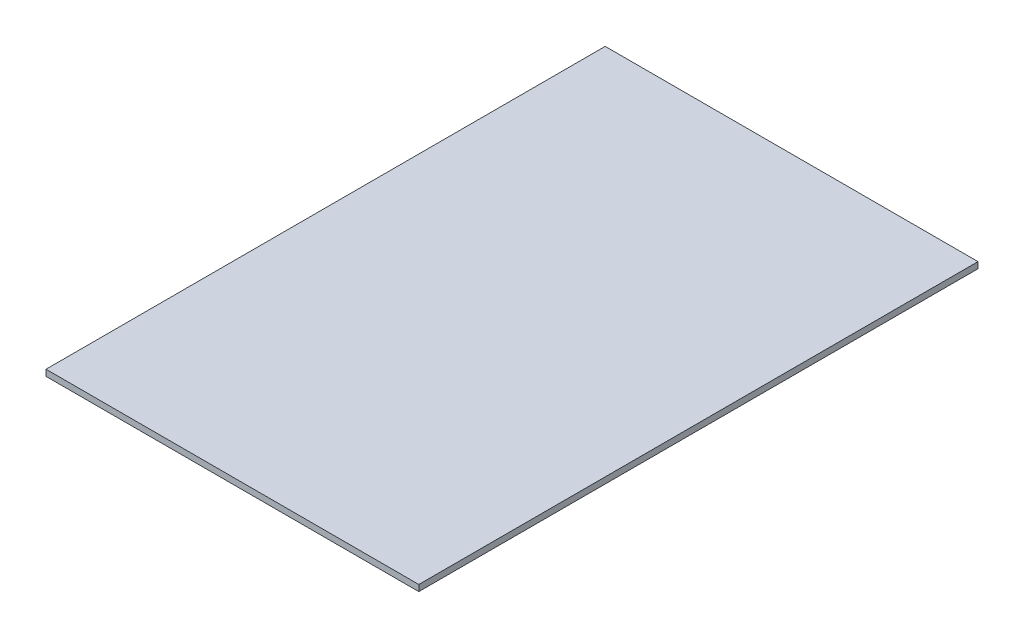
ISO-10303-21;
HEADER;
FILE_DESCRIPTION(('STEP AP214'),'2;1');
FILE_NAME('part.step','',(''),(''),'','','');
FILE_SCHEMA(('AUTOMOTIVE_DESIGN { 1 0 10303 214 1 1 1 1 }'));
ENDSEC;
DATA;
#1=APPLICATION_CONTEXT('core data for automotive mechanical design processes');
#2=APPLICATION_PROTOCOL_DEFINITION('international standard','automotive_design',2000,#1);
#3=PRODUCT_CONTEXT('',#1,'mechanical');
#4=PRODUCT('Part','Part','',(#3));
#5=PRODUCT_RELATED_PRODUCT_CATEGORY('part','',(#4));
#6=PRODUCT_DEFINITION_FORMATION('','',#4);
#7=PRODUCT_DEFINITION_CONTEXT('part definition',#1,'design');
#8=PRODUCT_DEFINITION('design','',#6,#7);
#9=PRODUCT_DEFINITION_SHAPE('','',#8);
#10=(LENGTH_UNIT() NAMED_UNIT(*) SI_UNIT(.MILLI.,.METRE.));
#11=(NAMED_UNIT(*) PLANE_ANGLE_UNIT() SI_UNIT($,.RADIAN.));
#12=(NAMED_UNIT(*) SI_UNIT($,.STERADIAN.) SOLID_ANGLE_UNIT());
#13=UNCERTAINTY_MEASURE_WITH_UNIT(LENGTH_MEASURE(1.E-05),#10,'distance_accuracy_value','');
#14=(GEOMETRIC_REPRESENTATION_CONTEXT(3) GLOBAL_UNCERTAINTY_ASSIGNED_CONTEXT((#13)) GLOBAL_UNIT_ASSIGNED_CONTEXT((#10,
#11,#12)) REPRESENTATION_CONTEXT('',''));
#15=CARTESIAN_POINT('',(0.,0.,0.));
#16=DIRECTION('',(0.,0.,1.));
#17=DIRECTION('',(1.,0.,0.));
#18=AXIS2_PLACEMENT_3D('',#15,#16,#17);
#19=CARTESIAN_POINT('',(-60.,2.,-90.));
#20=DIRECTION('',(0.,0.,-1.));
#21=DIRECTION('',(-1.,0.,0.));
#22=AXIS2_PLACEMENT_3D('',#19,#20,#21);
#23=PLANE('',#22);
#24=DIRECTION('',(1.,0.,0.));
#25=VECTOR('',#24,1.);
#26=CARTESIAN_POINT('',(-60.,0.,-90.));
#27=LINE('',#26,#25);
#28=CARTESIAN_POINT('',(-60.,0.,-90.));
#29=VERTEX_POINT('',#28);
#30=CARTESIAN_POINT('',(60.,0.,-90.));
#31=VERTEX_POINT('',#30);
#32=EDGE_CURVE('E144',#29,#31,#27,.T.);
#33=ORIENTED_EDGE('',*,*,#32,.F.);
#34=DIRECTION('',(0.,-1.,0.));
#35=VECTOR('',#34,1.);
#36=CARTESIAN_POINT('',(-60.,2.,-90.));
#37=LINE('',#36,#35);
#38=CARTESIAN_POINT('',(-60.,2.,-90.));
#39=VERTEX_POINT('',#38);
#40=EDGE_CURVE('E12',#39,#29,#37,.T.);
#41=ORIENTED_EDGE('',*,*,#40,.F.);
#42=DIRECTION('',(1.,0.,0.));
#43=VECTOR('',#42,1.);
#44=CARTESIAN_POINT('',(-60.,2.,-90.));
#45=LINE('',#44,#43);
#46=CARTESIAN_POINT('',(60.,2.,-90.));
#47=VERTEX_POINT('',#46);
#48=EDGE_CURVE('E117',#39,#47,#45,.T.);
#49=ORIENTED_EDGE('',*,*,#48,.T.);
#50=DIRECTION('',(0.,-1.,0.));
#51=VECTOR('',#50,1.);
#52=CARTESIAN_POINT('',(60.,2.,-90.));
#53=LINE('',#52,#51);
#54=EDGE_CURVE('E47',#47,#31,#53,.T.);
#55=ORIENTED_EDGE('',*,*,#54,.T.);
#56=EDGE_LOOP('',(#33,#41,#49,#55));
#57=FACE_BOUND('',#56,.T.);
#58=ADVANCED_FACE('F43',(#57),#23,.T.);
#59=CARTESIAN_POINT('',(-60.,2.,-90.));
#60=DIRECTION('',(1.,0.,0.));
#61=DIRECTION('',(0.,0.,-1.));
#62=AXIS2_PLACEMENT_3D('',#59,#60,#61);
#63=PLANE('',#62);
#64=DIRECTION('',(0.,0.,1.));
#65=VECTOR('',#64,1.);
#66=CARTESIAN_POINT('',(-60.,0.,-90.));
#67=LINE('',#66,#65);
#68=CARTESIAN_POINT('',(-60.,0.,90.));
#69=VERTEX_POINT('',#68);
#70=EDGE_CURVE('E85',#29,#69,#67,.T.);
#71=ORIENTED_EDGE('',*,*,#70,.T.);
#72=DIRECTION('',(0.,-1.,0.));
#73=VECTOR('',#72,1.);
#74=CARTESIAN_POINT('',(-60.,2.,90.));
#75=LINE('',#74,#73);
#76=CARTESIAN_POINT('',(-60.,2.,90.));
#77=VERTEX_POINT('',#76);
#78=EDGE_CURVE('E55',#77,#69,#75,.T.);
#79=ORIENTED_EDGE('',*,*,#78,.F.);
#80=DIRECTION('',(0.,0.,1.));
#81=VECTOR('',#80,1.);
#82=CARTESIAN_POINT('',(-60.,2.,-90.));
#83=LINE('',#82,#81);
#84=EDGE_CURVE('E104',#39,#77,#83,.T.);
#85=ORIENTED_EDGE('',*,*,#84,.F.);
#86=ORIENTED_EDGE('',*,*,#40,.T.);
#87=EDGE_LOOP('',(#71,#79,#85,#86));
#88=FACE_BOUND('',#87,.T.);
#89=ADVANCED_FACE('F168',(#88),#63,.F.);
#90=CARTESIAN_POINT('',(-60.,2.,90.));
#91=DIRECTION('',(0.,0.,-1.));
#92=DIRECTION('',(-1.,0.,0.));
#93=AXIS2_PLACEMENT_3D('',#90,#91,#92);
#94=PLANE('',#93);
#95=DIRECTION('',(1.,0.,0.));
#96=VECTOR('',#95,1.);
#97=CARTESIAN_POINT('',(-60.,0.,90.));
#98=LINE('',#97,#96);
#99=CARTESIAN_POINT('',(60.,0.,90.));
#100=VERTEX_POINT('',#99);
#101=EDGE_CURVE('E112',#69,#100,#98,.T.);
#102=ORIENTED_EDGE('',*,*,#101,.T.);
#103=DIRECTION('',(0.,-1.,0.));
#104=VECTOR('',#103,1.);
#105=CARTESIAN_POINT('',(60.,2.,90.));
#106=LINE('',#105,#104);
#107=CARTESIAN_POINT('',(60.,2.,90.));
#108=VERTEX_POINT('',#107);
#109=EDGE_CURVE('E109',#108,#100,#106,.T.);
#110=ORIENTED_EDGE('',*,*,#109,.F.);
#111=DIRECTION('',(1.,0.,0.));
#112=VECTOR('',#111,1.);
#113=CARTESIAN_POINT('',(-60.,2.,90.));
#114=LINE('',#113,#112);
#115=EDGE_CURVE('E99',#77,#108,#114,.T.);
#116=ORIENTED_EDGE('',*,*,#115,.F.);
#117=ORIENTED_EDGE('',*,*,#78,.T.);
#118=EDGE_LOOP('',(#102,#110,#116,#117));
#119=FACE_BOUND('',#118,.T.);
#120=ADVANCED_FACE('F110',(#119),#94,.F.);
#121=CARTESIAN_POINT('',(60.,2.,-90.));
#122=DIRECTION('',(1.,0.,0.));
#123=DIRECTION('',(0.,0.,-1.));
#124=AXIS2_PLACEMENT_3D('',#121,#122,#123);
#125=PLANE('',#124);
#126=DIRECTION('',(0.,0.,1.));
#127=VECTOR('',#126,1.);
#128=CARTESIAN_POINT('',(60.,0.,-90.));
#129=LINE('',#128,#127);
#130=EDGE_CURVE('E149',#31,#100,#129,.T.);
#131=ORIENTED_EDGE('',*,*,#130,.F.);
#132=ORIENTED_EDGE('',*,*,#54,.F.);
#133=DIRECTION('',(0.,0.,1.));
#134=VECTOR('',#133,1.);
#135=CARTESIAN_POINT('',(60.,2.,-90.));
#136=LINE('',#135,#134);
#137=EDGE_CURVE('E103',#47,#108,#136,.T.);
#138=ORIENTED_EDGE('',*,*,#137,.T.);
#139=ORIENTED_EDGE('',*,*,#109,.T.);
#140=EDGE_LOOP('',(#131,#132,#138,#139));
#141=FACE_BOUND('',#140,.T.);
#142=ADVANCED_FACE('F115',(#141),#125,.T.);
#143=CARTESIAN_POINT('',(0.,2.,0.));
#144=DIRECTION('',(0.,-1.,0.));
#145=DIRECTION('',(0.,0.,-1.));
#146=AXIS2_PLACEMENT_3D('',#143,#144,#145);
#147=PLANE('',#146);
#148=ORIENTED_EDGE('',*,*,#48,.F.);
#149=ORIENTED_EDGE('',*,*,#84,.T.);
#150=ORIENTED_EDGE('',*,*,#115,.T.);
#151=ORIENTED_EDGE('',*,*,#137,.F.);
#152=EDGE_LOOP('',(#148,#149,#150,#151));
#153=FACE_BOUND('',#152,.T.);
#154=ADVANCED_FACE('F102',(#153),#147,.F.);
#155=CARTESIAN_POINT('',(0.,0.,0.));
#156=DIRECTION('',(0.,-1.,0.));
#157=DIRECTION('',(0.,0.,-1.));
#158=AXIS2_PLACEMENT_3D('',#155,#156,#157);
#159=PLANE('',#158);
#160=ORIENTED_EDGE('',*,*,#32,.T.);
#161=ORIENTED_EDGE('',*,*,#130,.T.);
#162=ORIENTED_EDGE('',*,*,#101,.F.);
#163=ORIENTED_EDGE('',*,*,#70,.F.);
#164=EDGE_LOOP('',(#160,#161,#162,#163));
#165=FACE_BOUND('',#164,.T.);
#166=ADVANCED_FACE('F158',(#165),#159,.T.);
#167=CLOSED_SHELL('',(#58,#89,#120,#142,#154,#166));
#168=MANIFOLD_SOLID_BREP('B2',#167);
#169=ADVANCED_BREP_SHAPE_REPRESENTATION('',(#18,#168),#14);
#170=SHAPE_DEFINITION_REPRESENTATION(#9,#169);
ENDSEC;
END-ISO-10303-21;
